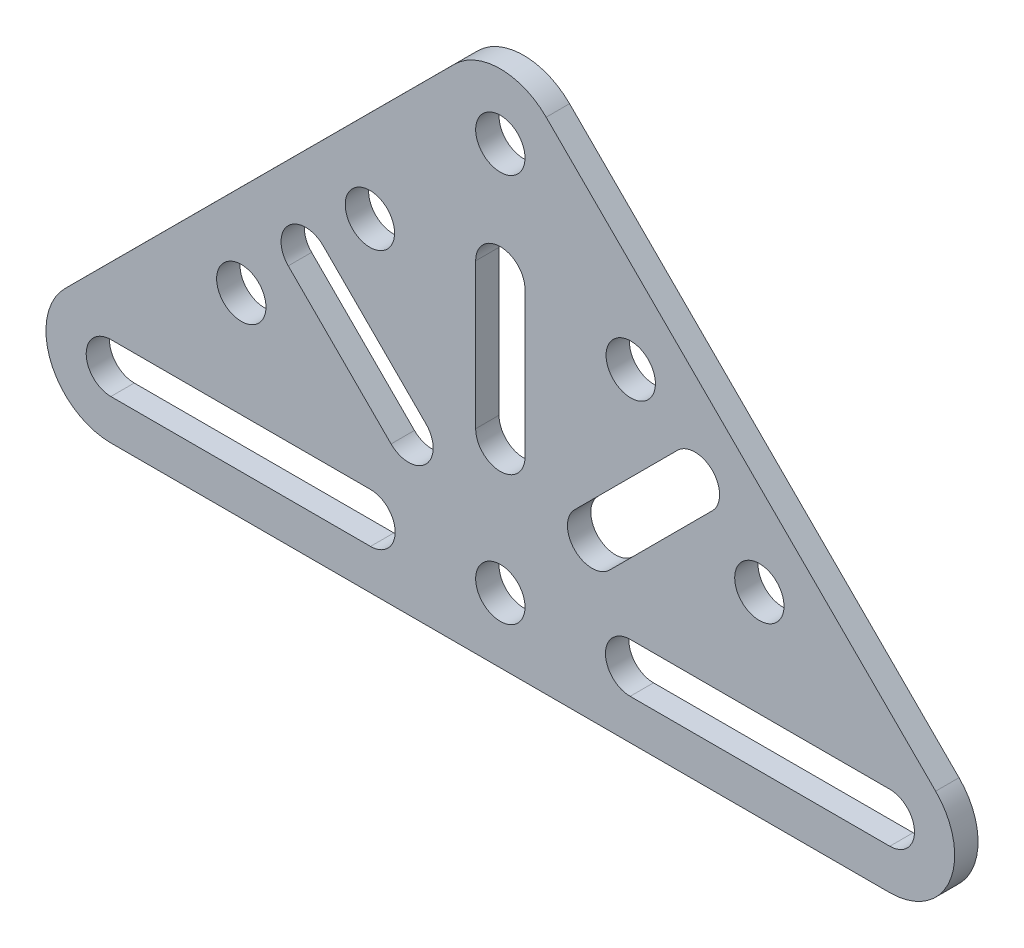
ISO-10303-21;
HEADER;
FILE_DESCRIPTION(('STEP AP214'),'2;1');
FILE_NAME('part.step','',(''),(''),'','','');
FILE_SCHEMA(('AUTOMOTIVE_DESIGN { 1 0 10303 214 1 1 1 1 }'));
ENDSEC;
DATA;
#1=APPLICATION_CONTEXT('core data for automotive mechanical design processes');
#2=APPLICATION_PROTOCOL_DEFINITION('international standard','automotive_design',2000,#1);
#3=PRODUCT_CONTEXT('',#1,'mechanical');
#4=PRODUCT('Part','Part','',(#3));
#5=PRODUCT_RELATED_PRODUCT_CATEGORY('part','',(#4));
#6=PRODUCT_DEFINITION_FORMATION('','',#4);
#7=PRODUCT_DEFINITION_CONTEXT('part definition',#1,'design');
#8=PRODUCT_DEFINITION('design','',#6,#7);
#9=PRODUCT_DEFINITION_SHAPE('','',#8);
#10=(LENGTH_UNIT() NAMED_UNIT(*) SI_UNIT(.MILLI.,.METRE.));
#11=(NAMED_UNIT(*) PLANE_ANGLE_UNIT() SI_UNIT($,.RADIAN.));
#12=(NAMED_UNIT(*) SI_UNIT($,.STERADIAN.) SOLID_ANGLE_UNIT());
#13=UNCERTAINTY_MEASURE_WITH_UNIT(LENGTH_MEASURE(1.E-05),#10,'distance_accuracy_value','');
#14=(GEOMETRIC_REPRESENTATION_CONTEXT(3) GLOBAL_UNCERTAINTY_ASSIGNED_CONTEXT((#13)) GLOBAL_UNIT_ASSIGNED_CONTEXT((#10,
#11,#12)) REPRESENTATION_CONTEXT('',''));
#15=CARTESIAN_POINT('',(0.,0.,0.));
#16=DIRECTION('',(0.,0.,1.));
#17=DIRECTION('',(1.,0.,0.));
#18=AXIS2_PLACEMENT_3D('',#15,#16,#17);
#19=CARTESIAN_POINT('',(-38.1,0.,2.286));
#20=DIRECTION('',(0.,0.,-1.));
#21=DIRECTION('',(-1.,0.,0.));
#22=AXIS2_PLACEMENT_3D('',#19,#20,#21);
#23=CYLINDRICAL_SURFACE('',#22,6.35);
#24=CARTESIAN_POINT('',(-38.1,0.,0.));
#25=DIRECTION('',(0.,0.,1.));
#26=DIRECTION('',(1.,0.,0.));
#27=AXIS2_PLACEMENT_3D('',#24,#25,#26);
#28=CIRCLE('',#27,6.35);
#29=CARTESIAN_POINT('',(-42.5873298500313,4.492924528302,0.));
#30=VERTEX_POINT('',#29);
#31=CARTESIAN_POINT('',(-38.0999999999998,-6.35,0.));
#32=VERTEX_POINT('',#31);
#33=EDGE_CURVE('E417',#30,#32,#28,.T.);
#34=ORIENTED_EDGE('',*,*,#33,.T.);
#35=DIRECTION('',(0.,0.,-1.));
#36=VECTOR('',#35,1.);
#37=CARTESIAN_POINT('',(-38.0999999999998,-6.35,2.286));
#38=LINE('',#37,#36);
#39=CARTESIAN_POINT('',(-38.0999999999998,-6.35,2.286));
#40=VERTEX_POINT('',#39);
#41=EDGE_CURVE('E13',#40,#32,#38,.T.);
#42=ORIENTED_EDGE('',*,*,#41,.F.);
#43=CARTESIAN_POINT('',(-38.1,0.,2.286));
#44=DIRECTION('',(0.,0.,1.));
#45=DIRECTION('',(1.,0.,0.));
#46=AXIS2_PLACEMENT_3D('',#43,#44,#45);
#47=CIRCLE('',#46,6.35);
#48=CARTESIAN_POINT('',(-42.5873298500313,4.492924528302,2.286));
#49=VERTEX_POINT('',#48);
#50=EDGE_CURVE('E430',#49,#40,#47,.T.);
#51=ORIENTED_EDGE('',*,*,#50,.F.);
#52=DIRECTION('',(0.,0.,-1.));
#53=VECTOR('',#52,1.);
#54=CARTESIAN_POINT('',(-42.5873298500313,4.492924528302,2.286));
#55=LINE('',#54,#53);
#56=EDGE_CURVE('E443',#49,#30,#55,.T.);
#57=ORIENTED_EDGE('',*,*,#56,.T.);
#58=EDGE_LOOP('',(#34,#42,#51,#57));
#59=FACE_BOUND('',#58,.T.);
#60=ADVANCED_FACE('F46',(#59),#23,.T.);
#61=CARTESIAN_POINT('',(-38.0999999999998,-6.35,2.286));
#62=DIRECTION('',(0.,1.,0.));
#63=DIRECTION('',(-1.,0.,0.));
#64=AXIS2_PLACEMENT_3D('',#61,#62,#63);
#65=PLANE('',#64);
#66=DIRECTION('',(1.,0.,0.));
#67=VECTOR('',#66,1.);
#68=CARTESIAN_POINT('',(-38.0999999999998,-6.35,0.));
#69=LINE('',#68,#67);
#70=CARTESIAN_POINT('',(38.0999999999998,-6.35,0.));
#71=VERTEX_POINT('',#70);
#72=EDGE_CURVE('E420',#32,#71,#69,.T.);
#73=ORIENTED_EDGE('',*,*,#72,.T.);
#74=DIRECTION('',(0.,0.,-1.));
#75=VECTOR('',#74,1.);
#76=CARTESIAN_POINT('',(38.0999999999998,-6.35,2.286));
#77=LINE('',#76,#75);
#78=CARTESIAN_POINT('',(38.0999999999998,-6.35,2.286));
#79=VERTEX_POINT('',#78);
#80=EDGE_CURVE('E53',#79,#71,#77,.T.);
#81=ORIENTED_EDGE('',*,*,#80,.F.);
#82=DIRECTION('',(1.,0.,0.));
#83=VECTOR('',#82,1.);
#84=CARTESIAN_POINT('',(-38.0999999999998,-6.35,2.286));
#85=LINE('',#84,#83);
#86=EDGE_CURVE('E433',#40,#79,#85,.T.);
#87=ORIENTED_EDGE('',*,*,#86,.F.);
#88=ORIENTED_EDGE('',*,*,#41,.T.);
#89=EDGE_LOOP('',(#73,#81,#87,#88));
#90=FACE_BOUND('',#89,.T.);
#91=ADVANCED_FACE('F481',(#90),#65,.F.);
#92=CARTESIAN_POINT('',(38.1,0.,2.286));
#93=DIRECTION('',(0.,0.,-1.));
#94=DIRECTION('',(-1.,0.,0.));
#95=AXIS2_PLACEMENT_3D('',#92,#93,#94);
#96=CYLINDRICAL_SURFACE('',#95,6.35);
#97=CARTESIAN_POINT('',(38.1,0.,0.));
#98=DIRECTION('',(0.,0.,1.));
#99=DIRECTION('',(-1.,0.,0.));
#100=AXIS2_PLACEMENT_3D('',#97,#98,#99);
#101=CIRCLE('',#100,6.35);
#102=CARTESIAN_POINT('',(42.5873298500313,4.492924528302,0.));
#103=VERTEX_POINT('',#102);
#104=EDGE_CURVE('E422',#71,#103,#101,.T.);
#105=ORIENTED_EDGE('',*,*,#104,.T.);
#106=DIRECTION('',(0.,0.,-1.));
#107=VECTOR('',#106,1.);
#108=CARTESIAN_POINT('',(42.5873298500313,4.492924528302,2.286));
#109=LINE('',#108,#107);
#110=CARTESIAN_POINT('',(42.5873298500313,4.492924528302,2.286));
#111=VERTEX_POINT('',#110);
#112=EDGE_CURVE('E452',#111,#103,#109,.T.);
#113=ORIENTED_EDGE('',*,*,#112,.F.);
#114=CARTESIAN_POINT('',(38.1,0.,2.286));
#115=DIRECTION('',(0.,0.,1.));
#116=DIRECTION('',(-1.,0.,0.));
#117=AXIS2_PLACEMENT_3D('',#114,#115,#116);
#118=CIRCLE('',#117,6.35);
#119=EDGE_CURVE('E435',#79,#111,#118,.T.);
#120=ORIENTED_EDGE('',*,*,#119,.F.);
#121=ORIENTED_EDGE('',*,*,#80,.T.);
#122=EDGE_LOOP('',(#105,#113,#120,#121));
#123=FACE_BOUND('',#122,.T.);
#124=ADVANCED_FACE('F459',(#123),#96,.T.);
#125=CARTESIAN_POINT('',(42.5873298500313,4.492924528302,2.286));
#126=DIRECTION('',(-0.706666118115189,-0.707547169811321,0.));
#127=DIRECTION('',(0.707547169811321,-0.706666118115189,0.));
#128=AXIS2_PLACEMENT_3D('',#125,#126,#127);
#129=PLANE('',#128);
#130=DIRECTION('',(-0.707547169811321,0.706666118115189,0.));
#131=VECTOR('',#130,1.);
#132=CARTESIAN_POINT('',(42.5873298500313,4.492924528302,0.));
#133=LINE('',#132,#131);
#134=CARTESIAN_POINT('',(4.48732985003149,42.5454816565685,0.));
#135=VERTEX_POINT('',#134);
#136=EDGE_CURVE('E424',#103,#135,#133,.T.);
#137=ORIENTED_EDGE('',*,*,#136,.T.);
#138=DIRECTION('',(0.,0.,-1.));
#139=VECTOR('',#138,1.);
#140=CARTESIAN_POINT('',(4.48732985003149,42.5454816565685,2.286));
#141=LINE('',#140,#139);
#142=CARTESIAN_POINT('',(4.48732985003149,42.5454816565685,2.286));
#143=VERTEX_POINT('',#142);
#144=EDGE_CURVE('E449',#143,#135,#141,.T.);
#145=ORIENTED_EDGE('',*,*,#144,.F.);
#146=DIRECTION('',(-0.707547169811321,0.706666118115189,0.));
#147=VECTOR('',#146,1.);
#148=CARTESIAN_POINT('',(42.5873298500313,4.492924528302,2.286));
#149=LINE('',#148,#147);
#150=EDGE_CURVE('E437',#111,#143,#149,.T.);
#151=ORIENTED_EDGE('',*,*,#150,.F.);
#152=ORIENTED_EDGE('',*,*,#112,.T.);
#153=EDGE_LOOP('',(#137,#145,#151,#152));
#154=FACE_BOUND('',#153,.T.);
#155=ADVANCED_FACE('F470',(#154),#129,.F.);
#156=CARTESIAN_POINT('',(0.,38.0525571282667,2.286));
#157=DIRECTION('',(0.,0.,-1.));
#158=DIRECTION('',(-1.,0.,0.));
#159=AXIS2_PLACEMENT_3D('',#156,#157,#158);
#160=CYLINDRICAL_SURFACE('',#159,6.35);
#161=CARTESIAN_POINT('',(0.,38.0525571282667,0.));
#162=DIRECTION('',(0.,0.,1.));
#163=DIRECTION('',(-1.,0.,0.));
#164=AXIS2_PLACEMENT_3D('',#161,#162,#163);
#165=CIRCLE('',#164,6.35);
#166=CARTESIAN_POINT('',(-4.48732985003147,42.5454816565685,0.));
#167=VERTEX_POINT('',#166);
#168=EDGE_CURVE('E426',#135,#167,#165,.T.);
#169=ORIENTED_EDGE('',*,*,#168,.T.);
#170=DIRECTION('',(0.,0.,-1.));
#171=VECTOR('',#170,1.);
#172=CARTESIAN_POINT('',(-4.48732985003147,42.5454816565685,2.286));
#173=LINE('',#172,#171);
#174=CARTESIAN_POINT('',(-4.48732985003147,42.5454816565685,2.286));
#175=VERTEX_POINT('',#174);
#176=EDGE_CURVE('E446',#175,#167,#173,.T.);
#177=ORIENTED_EDGE('',*,*,#176,.F.);
#178=CARTESIAN_POINT('',(0.,38.0525571282667,2.286));
#179=DIRECTION('',(0.,0.,1.));
#180=DIRECTION('',(-1.,0.,0.));
#181=AXIS2_PLACEMENT_3D('',#178,#179,#180);
#182=CIRCLE('',#181,6.35);
#183=EDGE_CURVE('E439',#143,#175,#182,.T.);
#184=ORIENTED_EDGE('',*,*,#183,.F.);
#185=ORIENTED_EDGE('',*,*,#144,.T.);
#186=EDGE_LOOP('',(#169,#177,#184,#185));
#187=FACE_BOUND('',#186,.T.);
#188=ADVANCED_FACE('F474',(#187),#160,.T.);
#189=CARTESIAN_POINT('',(-42.5873298500313,4.492924528302,2.286));
#190=DIRECTION('',(0.706666118115189,-0.707547169811321,0.));
#191=DIRECTION('',(0.707547169811321,0.706666118115189,0.));
#192=AXIS2_PLACEMENT_3D('',#189,#190,#191);
#193=PLANE('',#192);
#194=DIRECTION('',(-0.707547169811321,-0.706666118115189,0.));
#195=VECTOR('',#194,1.);
#196=CARTESIAN_POINT('',(-42.5873298500313,4.492924528302,0.));
#197=LINE('',#196,#195);
#198=EDGE_CURVE('E428',#167,#30,#197,.T.);
#199=ORIENTED_EDGE('',*,*,#198,.T.);
#200=ORIENTED_EDGE('',*,*,#56,.F.);
#201=DIRECTION('',(-0.707547169811321,-0.706666118115189,0.));
#202=VECTOR('',#201,1.);
#203=CARTESIAN_POINT('',(-42.5873298500313,4.492924528302,2.286));
#204=LINE('',#203,#202);
#205=EDGE_CURVE('E441',#175,#49,#204,.T.);
#206=ORIENTED_EDGE('',*,*,#205,.F.);
#207=ORIENTED_EDGE('',*,*,#176,.T.);
#208=EDGE_LOOP('',(#199,#200,#206,#207));
#209=FACE_BOUND('',#208,.T.);
#210=ADVANCED_FACE('F484',(#209),#193,.F.);
#211=CARTESIAN_POINT('',(-38.1,0.,2.286));
#212=DIRECTION('',(0.,0.,1.));
#213=DIRECTION('',(1.,0.,0.));
#214=AXIS2_PLACEMENT_3D('',#211,#212,#213);
#215=PLANE('',#214);
#216=CARTESIAN_POINT('',(19.0391948819438,19.0391948819437,2.286));
#217=DIRECTION('',(0.,0.,1.));
#218=DIRECTION('',(0.,-1.,0.));
#219=AXIS2_PLACEMENT_3D('',#216,#217,#218);
#220=CIRCLE('',#219,2.413);
#221=CARTESIAN_POINT('',(20.745443544947,17.3329462189405,2.286));
#222=VERTEX_POINT('',#221);
#223=CARTESIAN_POINT('',(17.3329462189407,20.7454435449468,2.286));
#224=VERTEX_POINT('',#223);
#225=EDGE_CURVE('E60',#222,#224,#220,.T.);
#226=ORIENTED_EDGE('',*,*,#225,.F.);
#227=DIRECTION('',(0.70710678118655,0.707106781186545,0.));
#228=VECTOR('',#227,1.);
#229=CARTESIAN_POINT('',(20.745443544947,17.3329462189405,2.286));
#230=LINE('',#229,#228);
#231=CARTESIAN_POINT('',(10.6875566893495,7.27505936334313,2.286));
#232=VERTEX_POINT('',#231);
#233=EDGE_CURVE('E236',#232,#222,#230,.T.);
#234=ORIENTED_EDGE('',*,*,#233,.F.);
#235=CARTESIAN_POINT('',(8.98130802634634,8.98130802634627,2.286));
#236=DIRECTION('',(0.,0.,1.));
#237=DIRECTION('',(0.,1.,0.));
#238=AXIS2_PLACEMENT_3D('',#235,#236,#237);
#239=CIRCLE('',#238,2.413);
#240=CARTESIAN_POINT('',(7.2750593633432,10.6875566893494,2.286));
#241=VERTEX_POINT('',#240);
#242=EDGE_CURVE('E230',#241,#232,#239,.T.);
#243=ORIENTED_EDGE('',*,*,#242,.F.);
#244=DIRECTION('',(-0.70710678118655,-0.707106781186545,0.));
#245=VECTOR('',#244,1.);
#246=CARTESIAN_POINT('',(17.3329462189407,20.7454435449468,2.286));
#247=LINE('',#246,#245);
#248=EDGE_CURVE('E220',#224,#241,#247,.T.);
#249=ORIENTED_EDGE('',*,*,#248,.F.);
#250=EDGE_LOOP('',(#226,#234,#243,#249));
#251=FACE_BOUND('',#250,.T.);
#252=CARTESIAN_POINT('',(0.,26.9254876187093,2.286));
#253=DIRECTION('',(0.,0.,1.));
#254=DIRECTION('',(0.707106781186546,-0.707106781186549,0.));
#255=AXIS2_PLACEMENT_3D('',#252,#253,#254);
#256=CIRCLE('',#255,2.413);
#257=CARTESIAN_POINT('',(2.41300000000005,26.9254876187093,2.286));
#258=VERTEX_POINT('',#257);
#259=CARTESIAN_POINT('',(-2.41299999999995,26.9254876187093,2.286));
#260=VERTEX_POINT('',#259);
#261=EDGE_CURVE('E280',#258,#260,#256,.T.);
#262=ORIENTED_EDGE('',*,*,#261,.F.);
#263=DIRECTION('',(0.,1.,0.));
#264=VECTOR('',#263,1.);
#265=CARTESIAN_POINT('',(2.41300000000005,26.9254876187093,2.286));
#266=LINE('',#265,#264);
#267=CARTESIAN_POINT('',(2.41300000000002,12.7014876187093,2.286));
#268=VERTEX_POINT('',#267);
#269=EDGE_CURVE('E272',#268,#258,#266,.T.);
#270=ORIENTED_EDGE('',*,*,#269,.F.);
#271=CARTESIAN_POINT('',(0.,12.7014876187093,2.286));
#272=DIRECTION('',(0.,0.,1.));
#273=DIRECTION('',(-0.707106781186546,0.707106781186549,0.));
#274=AXIS2_PLACEMENT_3D('',#271,#272,#273);
#275=CIRCLE('',#274,2.413);
#276=CARTESIAN_POINT('',(-2.41299999999998,12.7014876187093,2.286));
#277=VERTEX_POINT('',#276);
#278=EDGE_CURVE('E264',#277,#268,#275,.T.);
#279=ORIENTED_EDGE('',*,*,#278,.F.);
#280=DIRECTION('',(0.,-1.,0.));
#281=VECTOR('',#280,1.);
#282=CARTESIAN_POINT('',(-2.41299999999995,26.9254876187093,2.286));
#283=LINE('',#282,#281);
#284=EDGE_CURVE('E253',#260,#277,#283,.T.);
#285=ORIENTED_EDGE('',*,*,#284,.F.);
#286=EDGE_LOOP('',(#262,#270,#279,#285));
#287=FACE_BOUND('',#286,.T.);
#288=CARTESIAN_POINT('',(-19.0391948819438,19.0391948819438,2.286));
#289=DIRECTION('',(0.,0.,1.));
#290=DIRECTION('',(1.,0.,0.));
#291=AXIS2_PLACEMENT_3D('',#288,#289,#290);
#292=CIRCLE('',#291,2.413);
#293=CARTESIAN_POINT('',(-17.3329462189406,20.7454435449469,2.286));
#294=VERTEX_POINT('',#293);
#295=CARTESIAN_POINT('',(-20.7454435449469,17.3329462189406,2.286));
#296=VERTEX_POINT('',#295);
#297=EDGE_CURVE('E285',#294,#296,#292,.T.);
#298=ORIENTED_EDGE('',*,*,#297,.F.);
#299=DIRECTION('',(-0.707106781186547,0.707106781186548,0.));
#300=VECTOR('',#299,1.);
#301=CARTESIAN_POINT('',(-17.3329462189406,20.7454435449469,2.286));
#302=LINE('',#301,#300);
#303=CARTESIAN_POINT('',(-7.27505936334317,10.6875566893494,2.286));
#304=VERTEX_POINT('',#303);
#305=EDGE_CURVE('E293',#304,#294,#302,.T.);
#306=ORIENTED_EDGE('',*,*,#305,.F.);
#307=CARTESIAN_POINT('',(-8.9813080263463,8.9813080263463,2.286));
#308=DIRECTION('',(0.,0.,1.));
#309=DIRECTION('',(-1.,0.,0.));
#310=AXIS2_PLACEMENT_3D('',#307,#308,#309);
#311=CIRCLE('',#310,2.413);
#312=CARTESIAN_POINT('',(-10.6875566893494,7.27505936334317,2.286));
#313=VERTEX_POINT('',#312);
#314=EDGE_CURVE('E290',#313,#304,#311,.T.);
#315=ORIENTED_EDGE('',*,*,#314,.F.);
#316=DIRECTION('',(0.707106781186547,-0.707106781186547,0.));
#317=VECTOR('',#316,1.);
#318=CARTESIAN_POINT('',(-20.7454435449469,17.3329462189406,2.286));
#319=LINE('',#318,#317);
#320=EDGE_CURVE('E287',#296,#313,#319,.T.);
#321=ORIENTED_EDGE('',*,*,#320,.F.);
#322=EDGE_LOOP('',(#298,#306,#315,#321));
#323=FACE_BOUND('',#322,.T.);
#324=CARTESIAN_POINT('',(38.1,0.,2.286));
#325=DIRECTION('',(0.,0.,-1.));
#326=DIRECTION('',(-1.,0.,0.));
#327=AXIS2_PLACEMENT_3D('',#324,#325,#326);
#328=CIRCLE('',#327,2.413);
#329=CARTESIAN_POINT('',(38.1,2.413,2.286));
#330=VERTEX_POINT('',#329);
#331=CARTESIAN_POINT('',(38.1,-2.413,2.286));
#332=VERTEX_POINT('',#331);
#333=EDGE_CURVE('E344',#330,#332,#328,.T.);
#334=ORIENTED_EDGE('',*,*,#333,.T.);
#335=DIRECTION('',(-1.,0.,0.));
#336=VECTOR('',#335,1.);
#337=CARTESIAN_POINT('',(38.1,-2.413,2.286));
#338=LINE('',#337,#336);
#339=CARTESIAN_POINT('',(12.7,-2.413,2.286));
#340=VERTEX_POINT('',#339);
#341=EDGE_CURVE('E311',#332,#340,#338,.T.);
#342=ORIENTED_EDGE('',*,*,#341,.T.);
#343=CARTESIAN_POINT('',(12.7,0.,2.286));
#344=DIRECTION('',(0.,0.,-1.));
#345=DIRECTION('',(1.,0.,0.));
#346=AXIS2_PLACEMENT_3D('',#343,#344,#345);
#347=CIRCLE('',#346,2.413);
#348=CARTESIAN_POINT('',(12.7,2.413,2.286));
#349=VERTEX_POINT('',#348);
#350=EDGE_CURVE('E328',#340,#349,#347,.T.);
#351=ORIENTED_EDGE('',*,*,#350,.T.);
#352=DIRECTION('',(1.,0.,0.));
#353=VECTOR('',#352,1.);
#354=CARTESIAN_POINT('',(38.1,2.413,2.286));
#355=LINE('',#354,#353);
#356=EDGE_CURVE('E336',#349,#330,#355,.T.);
#357=ORIENTED_EDGE('',*,*,#356,.T.);
#358=EDGE_LOOP('',(#334,#342,#351,#357));
#359=FACE_BOUND('',#358,.T.);
#360=CARTESIAN_POINT('',(-38.1,0.,2.286));
#361=DIRECTION('',(0.,0.,1.));
#362=DIRECTION('',(1.,0.,0.));
#363=AXIS2_PLACEMENT_3D('',#360,#361,#362);
#364=CIRCLE('',#363,2.413);
#365=CARTESIAN_POINT('',(-38.1,2.413,2.286));
#366=VERTEX_POINT('',#365);
#367=CARTESIAN_POINT('',(-38.1,-2.413,2.286));
#368=VERTEX_POINT('',#367);
#369=EDGE_CURVE('E349',#366,#368,#364,.T.);
#370=ORIENTED_EDGE('',*,*,#369,.F.);
#371=DIRECTION('',(-1.,0.,0.));
#372=VECTOR('',#371,1.);
#373=CARTESIAN_POINT('',(-38.1,2.413,2.286));
#374=LINE('',#373,#372);
#375=CARTESIAN_POINT('',(-12.7,2.413,2.286));
#376=VERTEX_POINT('',#375);
#377=EDGE_CURVE('E357',#376,#366,#374,.T.);
#378=ORIENTED_EDGE('',*,*,#377,.F.);
#379=CARTESIAN_POINT('',(-12.7,0.,2.286));
#380=DIRECTION('',(0.,0.,1.));
#381=DIRECTION('',(-1.,0.,0.));
#382=AXIS2_PLACEMENT_3D('',#379,#380,#381);
#383=CIRCLE('',#382,2.413);
#384=CARTESIAN_POINT('',(-12.7,-2.413,2.286));
#385=VERTEX_POINT('',#384);
#386=EDGE_CURVE('E354',#385,#376,#383,.T.);
#387=ORIENTED_EDGE('',*,*,#386,.F.);
#388=DIRECTION('',(1.,0.,0.));
#389=VECTOR('',#388,1.);
#390=CARTESIAN_POINT('',(-38.1,-2.413,2.286));
#391=LINE('',#390,#389);
#392=EDGE_CURVE('E351',#368,#385,#391,.T.);
#393=ORIENTED_EDGE('',*,*,#392,.F.);
#394=EDGE_LOOP('',(#370,#378,#387,#393));
#395=FACE_BOUND('',#394,.T.);
#396=CARTESIAN_POINT('',(12.7599056603774,25.3085403541774,2.286));
#397=DIRECTION('',(0.,0.,1.));
#398=DIRECTION('',(-1.,0.,0.));
#399=AXIS2_PLACEMENT_3D('',#396,#397,#398);
#400=CIRCLE('',#399,2.413);
#401=CARTESIAN_POINT('',(10.3469056603774,25.3085403541774,2.286));
#402=VERTEX_POINT('',#401);
#403=EDGE_CURVE('E375',#402,#402,#400,.T.);
#404=ORIENTED_EDGE('',*,*,#403,.F.);
#405=EDGE_LOOP('',(#404));
#406=FACE_BOUND('',#405,.T.);
#407=CARTESIAN_POINT('',(-12.7599056603774,25.3085403541774,2.286));
#408=DIRECTION('',(0.,0.,1.));
#409=DIRECTION('',(1.,0.,0.));
#410=AXIS2_PLACEMENT_3D('',#407,#408,#409);
#411=CIRCLE('',#410,2.413);
#412=CARTESIAN_POINT('',(-10.3469056603774,25.3085403541774,2.286));
#413=VERTEX_POINT('',#412);
#414=EDGE_CURVE('E387',#413,#413,#411,.T.);
#415=ORIENTED_EDGE('',*,*,#414,.F.);
#416=EDGE_LOOP('',(#415));
#417=FACE_BOUND('',#416,.T.);
#418=CARTESIAN_POINT('',(25.3400943396226,12.7440167740893,2.286));
#419=DIRECTION('',(0.,0.,1.));
#420=DIRECTION('',(-1.,0.,0.));
#421=AXIS2_PLACEMENT_3D('',#418,#419,#420);
#422=CIRCLE('',#421,2.41299999999999);
#423=CARTESIAN_POINT('',(22.9270943396226,12.7440167740893,2.286));
#424=VERTEX_POINT('',#423);
#425=EDGE_CURVE('E393',#424,#424,#422,.T.);
#426=ORIENTED_EDGE('',*,*,#425,.F.);
#427=EDGE_LOOP('',(#426));
#428=FACE_BOUND('',#427,.T.);
#429=CARTESIAN_POINT('',(-25.3400943396226,12.7440167740893,2.286));
#430=DIRECTION('',(0.,0.,1.));
#431=DIRECTION('',(1.,0.,0.));
#432=AXIS2_PLACEMENT_3D('',#429,#430,#431);
#433=CIRCLE('',#432,2.413);
#434=CARTESIAN_POINT('',(-22.9270943396226,12.7440167740893,2.286));
#435=VERTEX_POINT('',#434);
#436=EDGE_CURVE('E399',#435,#435,#433,.T.);
#437=ORIENTED_EDGE('',*,*,#436,.F.);
#438=EDGE_LOOP('',(#437));
#439=FACE_BOUND('',#438,.T.);
#440=CARTESIAN_POINT('',(0.,38.0525571282667,2.286));
#441=DIRECTION('',(0.,0.,1.));
#442=DIRECTION('',(1.,0.,0.));
#443=AXIS2_PLACEMENT_3D('',#440,#441,#442);
#444=CIRCLE('',#443,2.413);
#445=CARTESIAN_POINT('',(2.413,38.0525571282667,2.286));
#446=VERTEX_POINT('',#445);
#447=EDGE_CURVE('E405',#446,#446,#444,.T.);
#448=ORIENTED_EDGE('',*,*,#447,.F.);
#449=EDGE_LOOP('',(#448));
#450=FACE_BOUND('',#449,.T.);
#451=CARTESIAN_POINT('',(0.,0.,2.286));
#452=DIRECTION('',(0.,0.,1.));
#453=DIRECTION('',(1.,0.,0.));
#454=AXIS2_PLACEMENT_3D('',#451,#452,#453);
#455=CIRCLE('',#454,2.413);
#456=CARTESIAN_POINT('',(2.413,0.,2.286));
#457=VERTEX_POINT('',#456);
#458=EDGE_CURVE('E411',#457,#457,#455,.T.);
#459=ORIENTED_EDGE('',*,*,#458,.F.);
#460=EDGE_LOOP('',(#459));
#461=FACE_BOUND('',#460,.T.);
#462=ORIENTED_EDGE('',*,*,#50,.T.);
#463=ORIENTED_EDGE('',*,*,#86,.T.);
#464=ORIENTED_EDGE('',*,*,#119,.T.);
#465=ORIENTED_EDGE('',*,*,#150,.T.);
#466=ORIENTED_EDGE('',*,*,#183,.T.);
#467=ORIENTED_EDGE('',*,*,#205,.T.);
#468=EDGE_LOOP('',(#462,#463,#464,#465,#466,#467));
#469=FACE_BOUND('',#468,.T.);
#470=ADVANCED_FACE('F234',(#251,#287,#323,#359,#395,#406,#417,#428,#439,#450,#461,#469),#215,.T.);
#471=CARTESIAN_POINT('',(-38.1,0.,0.));
#472=DIRECTION('',(0.,0.,1.));
#473=DIRECTION('',(1.,0.,0.));
#474=AXIS2_PLACEMENT_3D('',#471,#472,#473);
#475=PLANE('',#474);
#476=DIRECTION('',(0.70710678118655,0.707106781186545,0.));
#477=VECTOR('',#476,1.);
#478=CARTESIAN_POINT('',(20.745443544947,17.3329462189405,0.));
#479=LINE('',#478,#477);
#480=CARTESIAN_POINT('',(10.6875566893495,7.27505936334313,0.));
#481=VERTEX_POINT('',#480);
#482=CARTESIAN_POINT('',(20.745443544947,17.3329462189405,0.));
#483=VERTEX_POINT('',#482);
#484=EDGE_CURVE('E246',#481,#483,#479,.T.);
#485=ORIENTED_EDGE('',*,*,#484,.T.);
#486=CARTESIAN_POINT('',(19.0391948819438,19.0391948819437,0.));
#487=DIRECTION('',(0.,0.,1.));
#488=DIRECTION('',(0.,-1.,0.));
#489=AXIS2_PLACEMENT_3D('',#486,#487,#488);
#490=CIRCLE('',#489,2.413);
#491=CARTESIAN_POINT('',(17.3329462189407,20.7454435449468,0.));
#492=VERTEX_POINT('',#491);
#493=EDGE_CURVE('E250',#483,#492,#490,.T.);
#494=ORIENTED_EDGE('',*,*,#493,.T.);
#495=DIRECTION('',(-0.70710678118655,-0.707106781186545,0.));
#496=VECTOR('',#495,1.);
#497=CARTESIAN_POINT('',(17.3329462189407,20.7454435449468,0.));
#498=LINE('',#497,#496);
#499=CARTESIAN_POINT('',(7.2750593633432,10.6875566893494,0.));
#500=VERTEX_POINT('',#499);
#501=EDGE_CURVE('E227',#492,#500,#498,.T.);
#502=ORIENTED_EDGE('',*,*,#501,.T.);
#503=CARTESIAN_POINT('',(8.98130802634634,8.98130802634627,0.));
#504=DIRECTION('',(0.,0.,1.));
#505=DIRECTION('',(0.,1.,0.));
#506=AXIS2_PLACEMENT_3D('',#503,#504,#505);
#507=CIRCLE('',#506,2.413);
#508=EDGE_CURVE('E68',#500,#481,#507,.T.);
#509=ORIENTED_EDGE('',*,*,#508,.T.);
#510=EDGE_LOOP('',(#485,#494,#502,#509));
#511=FACE_BOUND('',#510,.T.);
#512=DIRECTION('',(0.,1.,0.));
#513=VECTOR('',#512,1.);
#514=CARTESIAN_POINT('',(2.41300000000005,26.9254876187093,0.));
#515=LINE('',#514,#513);
#516=CARTESIAN_POINT('',(2.41300000000002,12.7014876187093,0.));
#517=VERTEX_POINT('',#516);
#518=CARTESIAN_POINT('',(2.41300000000005,26.9254876187093,0.));
#519=VERTEX_POINT('',#518);
#520=EDGE_CURVE('E277',#517,#519,#515,.T.);
#521=ORIENTED_EDGE('',*,*,#520,.T.);
#522=CARTESIAN_POINT('',(0.,26.9254876187093,0.));
#523=DIRECTION('',(0.,0.,1.));
#524=DIRECTION('',(0.707106781186546,-0.707106781186549,0.));
#525=AXIS2_PLACEMENT_3D('',#522,#523,#524);
#526=CIRCLE('',#525,2.413);
#527=CARTESIAN_POINT('',(-2.41299999999995,26.9254876187093,0.));
#528=VERTEX_POINT('',#527);
#529=EDGE_CURVE('E282',#519,#528,#526,.T.);
#530=ORIENTED_EDGE('',*,*,#529,.T.);
#531=DIRECTION('',(0.,-1.,0.));
#532=VECTOR('',#531,1.);
#533=CARTESIAN_POINT('',(-2.41299999999995,26.9254876187093,0.));
#534=LINE('',#533,#532);
#535=CARTESIAN_POINT('',(-2.41299999999998,12.7014876187093,0.));
#536=VERTEX_POINT('',#535);
#537=EDGE_CURVE('E255',#528,#536,#534,.T.);
#538=ORIENTED_EDGE('',*,*,#537,.T.);
#539=CARTESIAN_POINT('',(0.,12.7014876187093,0.));
#540=DIRECTION('',(0.,0.,1.));
#541=DIRECTION('',(-0.707106781186546,0.707106781186549,0.));
#542=AXIS2_PLACEMENT_3D('',#539,#540,#541);
#543=CIRCLE('',#542,2.413);
#544=EDGE_CURVE('E269',#536,#517,#543,.T.);
#545=ORIENTED_EDGE('',*,*,#544,.T.);
#546=EDGE_LOOP('',(#521,#530,#538,#545));
#547=FACE_BOUND('',#546,.T.);
#548=DIRECTION('',(-0.707106781186547,0.707106781186548,0.));
#549=VECTOR('',#548,1.);
#550=CARTESIAN_POINT('',(-17.3329462189406,20.7454435449469,0.));
#551=LINE('',#550,#549);
#552=CARTESIAN_POINT('',(-7.27505936334317,10.6875566893494,0.));
#553=VERTEX_POINT('',#552);
#554=CARTESIAN_POINT('',(-17.3329462189406,20.7454435449469,0.));
#555=VERTEX_POINT('',#554);
#556=EDGE_CURVE('E305',#553,#555,#551,.T.);
#557=ORIENTED_EDGE('',*,*,#556,.T.);
#558=CARTESIAN_POINT('',(-19.0391948819438,19.0391948819438,0.));
#559=DIRECTION('',(0.,0.,1.));
#560=DIRECTION('',(1.,0.,0.));
#561=AXIS2_PLACEMENT_3D('',#558,#559,#560);
#562=CIRCLE('',#561,2.413);
#563=CARTESIAN_POINT('',(-20.7454435449469,17.3329462189406,0.));
#564=VERTEX_POINT('',#563);
#565=EDGE_CURVE('E296',#555,#564,#562,.T.);
#566=ORIENTED_EDGE('',*,*,#565,.T.);
#567=DIRECTION('',(0.707106781186547,-0.707106781186547,0.));
#568=VECTOR('',#567,1.);
#569=CARTESIAN_POINT('',(-20.7454435449469,17.3329462189406,0.));
#570=LINE('',#569,#568);
#571=CARTESIAN_POINT('',(-10.6875566893494,7.27505936334317,0.));
#572=VERTEX_POINT('',#571);
#573=EDGE_CURVE('E299',#564,#572,#570,.T.);
#574=ORIENTED_EDGE('',*,*,#573,.T.);
#575=CARTESIAN_POINT('',(-8.9813080263463,8.9813080263463,0.));
#576=DIRECTION('',(0.,0.,1.));
#577=DIRECTION('',(-1.,0.,0.));
#578=AXIS2_PLACEMENT_3D('',#575,#576,#577);
#579=CIRCLE('',#578,2.413);
#580=EDGE_CURVE('E302',#572,#553,#579,.T.);
#581=ORIENTED_EDGE('',*,*,#580,.T.);
#582=EDGE_LOOP('',(#557,#566,#574,#581));
#583=FACE_BOUND('',#582,.T.);
#584=DIRECTION('',(-1.,0.,0.));
#585=VECTOR('',#584,1.);
#586=CARTESIAN_POINT('',(38.1,-2.413,0.));
#587=LINE('',#586,#585);
#588=CARTESIAN_POINT('',(38.1,-2.413,0.));
#589=VERTEX_POINT('',#588);
#590=CARTESIAN_POINT('',(12.7,-2.413,0.));
#591=VERTEX_POINT('',#590);
#592=EDGE_CURVE('E320',#589,#591,#587,.T.);
#593=ORIENTED_EDGE('',*,*,#592,.F.);
#594=CARTESIAN_POINT('',(38.1,0.,0.));
#595=DIRECTION('',(0.,0.,-1.));
#596=DIRECTION('',(-1.,0.,0.));
#597=AXIS2_PLACEMENT_3D('',#594,#595,#596);
#598=CIRCLE('',#597,2.413);
#599=CARTESIAN_POINT('',(38.1,2.413,0.));
#600=VERTEX_POINT('',#599);
#601=EDGE_CURVE('E347',#600,#589,#598,.T.);
#602=ORIENTED_EDGE('',*,*,#601,.F.);
#603=DIRECTION('',(1.,0.,0.));
#604=VECTOR('',#603,1.);
#605=CARTESIAN_POINT('',(38.1,2.413,0.));
#606=LINE('',#605,#604);
#607=CARTESIAN_POINT('',(12.7,2.413,0.));
#608=VERTEX_POINT('',#607);
#609=EDGE_CURVE('E341',#608,#600,#606,.T.);
#610=ORIENTED_EDGE('',*,*,#609,.F.);
#611=CARTESIAN_POINT('',(12.7,0.,0.));
#612=DIRECTION('',(0.,0.,-1.));
#613=DIRECTION('',(1.,0.,0.));
#614=AXIS2_PLACEMENT_3D('',#611,#612,#613);
#615=CIRCLE('',#614,2.413);
#616=EDGE_CURVE('E333',#591,#608,#615,.T.);
#617=ORIENTED_EDGE('',*,*,#616,.F.);
#618=EDGE_LOOP('',(#593,#602,#610,#617));
#619=FACE_BOUND('',#618,.T.);
#620=DIRECTION('',(-1.,0.,0.));
#621=VECTOR('',#620,1.);
#622=CARTESIAN_POINT('',(-38.1,2.413,0.));
#623=LINE('',#622,#621);
#624=CARTESIAN_POINT('',(-12.7,2.413,0.));
#625=VERTEX_POINT('',#624);
#626=CARTESIAN_POINT('',(-38.1,2.413,0.));
#627=VERTEX_POINT('',#626);
#628=EDGE_CURVE('E369',#625,#627,#623,.T.);
#629=ORIENTED_EDGE('',*,*,#628,.T.);
#630=CARTESIAN_POINT('',(-38.1,0.,0.));
#631=DIRECTION('',(0.,0.,1.));
#632=DIRECTION('',(1.,0.,0.));
#633=AXIS2_PLACEMENT_3D('',#630,#631,#632);
#634=CIRCLE('',#633,2.413);
#635=CARTESIAN_POINT('',(-38.1,-2.413,0.));
#636=VERTEX_POINT('',#635);
#637=EDGE_CURVE('E360',#627,#636,#634,.T.);
#638=ORIENTED_EDGE('',*,*,#637,.T.);
#639=DIRECTION('',(1.,0.,0.));
#640=VECTOR('',#639,1.);
#641=CARTESIAN_POINT('',(-38.1,-2.413,0.));
#642=LINE('',#641,#640);
#643=CARTESIAN_POINT('',(-12.7,-2.413,0.));
#644=VERTEX_POINT('',#643);
#645=EDGE_CURVE('E363',#636,#644,#642,.T.);
#646=ORIENTED_EDGE('',*,*,#645,.T.);
#647=CARTESIAN_POINT('',(-12.7,0.,0.));
#648=DIRECTION('',(0.,0.,1.));
#649=DIRECTION('',(-1.,0.,0.));
#650=AXIS2_PLACEMENT_3D('',#647,#648,#649);
#651=CIRCLE('',#650,2.413);
#652=EDGE_CURVE('E366',#644,#625,#651,.T.);
#653=ORIENTED_EDGE('',*,*,#652,.T.);
#654=EDGE_LOOP('',(#629,#638,#646,#653));
#655=FACE_BOUND('',#654,.T.);
#656=CARTESIAN_POINT('',(12.7599056603774,25.3085403541774,0.));
#657=DIRECTION('',(0.,0.,1.));
#658=DIRECTION('',(-1.,0.,0.));
#659=AXIS2_PLACEMENT_3D('',#656,#657,#658);
#660=CIRCLE('',#659,2.413);
#661=CARTESIAN_POINT('',(10.3469056603774,25.3085403541774,0.));
#662=VERTEX_POINT('',#661);
#663=EDGE_CURVE('E384',#662,#662,#660,.T.);
#664=ORIENTED_EDGE('',*,*,#663,.T.);
#665=EDGE_LOOP('',(#664));
#666=FACE_BOUND('',#665,.T.);
#667=CARTESIAN_POINT('',(-12.7599056603774,25.3085403541774,0.));
#668=DIRECTION('',(0.,0.,1.));
#669=DIRECTION('',(1.,0.,0.));
#670=AXIS2_PLACEMENT_3D('',#667,#668,#669);
#671=CIRCLE('',#670,2.413);
#672=CARTESIAN_POINT('',(-10.3469056603774,25.3085403541774,0.));
#673=VERTEX_POINT('',#672);
#674=EDGE_CURVE('E390',#673,#673,#671,.T.);
#675=ORIENTED_EDGE('',*,*,#674,.T.);
#676=EDGE_LOOP('',(#675));
#677=FACE_BOUND('',#676,.T.);
#678=CARTESIAN_POINT('',(25.3400943396226,12.7440167740893,0.));
#679=DIRECTION('',(0.,0.,1.));
#680=DIRECTION('',(-1.,0.,0.));
#681=AXIS2_PLACEMENT_3D('',#678,#679,#680);
#682=CIRCLE('',#681,2.41299999999999);
#683=CARTESIAN_POINT('',(22.9270943396226,12.7440167740893,0.));
#684=VERTEX_POINT('',#683);
#685=EDGE_CURVE('E396',#684,#684,#682,.T.);
#686=ORIENTED_EDGE('',*,*,#685,.T.);
#687=EDGE_LOOP('',(#686));
#688=FACE_BOUND('',#687,.T.);
#689=CARTESIAN_POINT('',(-25.3400943396226,12.7440167740893,0.));
#690=DIRECTION('',(0.,0.,1.));
#691=DIRECTION('',(1.,0.,0.));
#692=AXIS2_PLACEMENT_3D('',#689,#690,#691);
#693=CIRCLE('',#692,2.413);
#694=CARTESIAN_POINT('',(-22.9270943396226,12.7440167740893,0.));
#695=VERTEX_POINT('',#694);
#696=EDGE_CURVE('E402',#695,#695,#693,.T.);
#697=ORIENTED_EDGE('',*,*,#696,.T.);
#698=EDGE_LOOP('',(#697));
#699=FACE_BOUND('',#698,.T.);
#700=CARTESIAN_POINT('',(0.,38.0525571282667,0.));
#701=DIRECTION('',(0.,0.,1.));
#702=DIRECTION('',(1.,0.,0.));
#703=AXIS2_PLACEMENT_3D('',#700,#701,#702);
#704=CIRCLE('',#703,2.413);
#705=CARTESIAN_POINT('',(2.413,38.0525571282667,0.));
#706=VERTEX_POINT('',#705);
#707=EDGE_CURVE('E408',#706,#706,#704,.T.);
#708=ORIENTED_EDGE('',*,*,#707,.T.);
#709=EDGE_LOOP('',(#708));
#710=FACE_BOUND('',#709,.T.);
#711=CARTESIAN_POINT('',(0.,0.,0.));
#712=DIRECTION('',(0.,0.,1.));
#713=DIRECTION('',(1.,0.,0.));
#714=AXIS2_PLACEMENT_3D('',#711,#712,#713);
#715=CIRCLE('',#714,2.413);
#716=CARTESIAN_POINT('',(2.413,0.,0.));
#717=VERTEX_POINT('',#716);
#718=EDGE_CURVE('E414',#717,#717,#715,.T.);
#719=ORIENTED_EDGE('',*,*,#718,.T.);
#720=EDGE_LOOP('',(#719));
#721=FACE_BOUND('',#720,.T.);
#722=ORIENTED_EDGE('',*,*,#33,.F.);
#723=ORIENTED_EDGE('',*,*,#198,.F.);
#724=ORIENTED_EDGE('',*,*,#168,.F.);
#725=ORIENTED_EDGE('',*,*,#136,.F.);
#726=ORIENTED_EDGE('',*,*,#104,.F.);
#727=ORIENTED_EDGE('',*,*,#72,.F.);
#728=EDGE_LOOP('',(#722,#723,#724,#725,#726,#727));
#729=FACE_BOUND('',#728,.T.);
#730=ADVANCED_FACE('F465',(#511,#547,#583,#619,#655,#666,#677,#688,#699,#710,#721,#729),#475,.F.);
#731=CARTESIAN_POINT('',(0.,0.,0.));
#732=DIRECTION('',(0.,0.,1.));
#733=DIRECTION('',(1.,0.,0.));
#734=AXIS2_PLACEMENT_3D('',#731,#732,#733);
#735=CYLINDRICAL_SURFACE('',#734,2.413);
#736=ORIENTED_EDGE('',*,*,#718,.F.);
#737=EDGE_LOOP('',(#736));
#738=FACE_BOUND('',#737,.T.);
#739=ORIENTED_EDGE('',*,*,#458,.T.);
#740=EDGE_LOOP('',(#739));
#741=FACE_BOUND('',#740,.T.);
#742=ADVANCED_FACE('F521',(#738,#741),#735,.F.);
#743=CARTESIAN_POINT('',(0.,38.0525571282667,0.));
#744=DIRECTION('',(0.,0.,1.));
#745=DIRECTION('',(1.,0.,0.));
#746=AXIS2_PLACEMENT_3D('',#743,#744,#745);
#747=CYLINDRICAL_SURFACE('',#746,2.413);
#748=ORIENTED_EDGE('',*,*,#707,.F.);
#749=EDGE_LOOP('',(#748));
#750=FACE_BOUND('',#749,.T.);
#751=ORIENTED_EDGE('',*,*,#447,.T.);
#752=EDGE_LOOP('',(#751));
#753=FACE_BOUND('',#752,.T.);
#754=ADVANCED_FACE('F526',(#750,#753),#747,.F.);
#755=CARTESIAN_POINT('',(-25.3400943396226,12.7440167740893,0.));
#756=DIRECTION('',(0.,0.,1.));
#757=DIRECTION('',(1.,0.,0.));
#758=AXIS2_PLACEMENT_3D('',#755,#756,#757);
#759=CYLINDRICAL_SURFACE('',#758,2.413);
#760=ORIENTED_EDGE('',*,*,#696,.F.);
#761=EDGE_LOOP('',(#760));
#762=FACE_BOUND('',#761,.T.);
#763=ORIENTED_EDGE('',*,*,#436,.T.);
#764=EDGE_LOOP('',(#763));
#765=FACE_BOUND('',#764,.T.);
#766=ADVANCED_FACE('F538',(#762,#765),#759,.F.);
#767=CARTESIAN_POINT('',(25.3400943396226,12.7440167740893,0.));
#768=DIRECTION('',(0.,0.,1.));
#769=DIRECTION('',(1.,0.,0.));
#770=AXIS2_PLACEMENT_3D('',#767,#768,#769);
#771=CYLINDRICAL_SURFACE('',#770,2.41299999999999);
#772=ORIENTED_EDGE('',*,*,#685,.F.);
#773=EDGE_LOOP('',(#772));
#774=FACE_BOUND('',#773,.T.);
#775=ORIENTED_EDGE('',*,*,#425,.T.);
#776=EDGE_LOOP('',(#775));
#777=FACE_BOUND('',#776,.T.);
#778=ADVANCED_FACE('F548',(#774,#777),#771,.F.);
#779=CARTESIAN_POINT('',(-12.7599056603774,25.3085403541774,0.));
#780=DIRECTION('',(0.,0.,1.));
#781=DIRECTION('',(1.,0.,0.));
#782=AXIS2_PLACEMENT_3D('',#779,#780,#781);
#783=CYLINDRICAL_SURFACE('',#782,2.413);
#784=ORIENTED_EDGE('',*,*,#674,.F.);
#785=EDGE_LOOP('',(#784));
#786=FACE_BOUND('',#785,.T.);
#787=ORIENTED_EDGE('',*,*,#414,.T.);
#788=EDGE_LOOP('',(#787));
#789=FACE_BOUND('',#788,.T.);
#790=ADVANCED_FACE('F558',(#786,#789),#783,.F.);
#791=CARTESIAN_POINT('',(12.7599056603774,25.3085403541774,0.));
#792=DIRECTION('',(0.,0.,1.));
#793=DIRECTION('',(1.,0.,0.));
#794=AXIS2_PLACEMENT_3D('',#791,#792,#793);
#795=CYLINDRICAL_SURFACE('',#794,2.413);
#796=ORIENTED_EDGE('',*,*,#663,.F.);
#797=EDGE_LOOP('',(#796));
#798=FACE_BOUND('',#797,.T.);
#799=ORIENTED_EDGE('',*,*,#403,.T.);
#800=EDGE_LOOP('',(#799));
#801=FACE_BOUND('',#800,.T.);
#802=ADVANCED_FACE('F568',(#798,#801),#795,.F.);
#803=CARTESIAN_POINT('',(-38.1,0.,0.));
#804=DIRECTION('',(0.,0.,1.));
#805=DIRECTION('',(1.,0.,0.));
#806=AXIS2_PLACEMENT_3D('',#803,#804,#805);
#807=CYLINDRICAL_SURFACE('',#806,2.413);
#808=ORIENTED_EDGE('',*,*,#369,.T.);
#809=DIRECTION('',(0.,0.,1.));
#810=VECTOR('',#809,1.);
#811=CARTESIAN_POINT('',(-38.1,-2.413,0.));
#812=LINE('',#811,#810);
#813=EDGE_CURVE('E372',#636,#368,#812,.T.);
#814=ORIENTED_EDGE('',*,*,#813,.F.);
#815=ORIENTED_EDGE('',*,*,#637,.F.);
#816=DIRECTION('',(0.,0.,1.));
#817=VECTOR('',#816,1.);
#818=CARTESIAN_POINT('',(-38.1,2.413,0.));
#819=LINE('',#818,#817);
#820=EDGE_CURVE('E373',#627,#366,#819,.T.);
#821=ORIENTED_EDGE('',*,*,#820,.T.);
#822=EDGE_LOOP('',(#808,#814,#815,#821));
#823=FACE_BOUND('',#822,.T.);
#824=ADVANCED_FACE('F578',(#823),#807,.F.);
#825=CARTESIAN_POINT('',(-38.1,2.413,0.));
#826=DIRECTION('',(0.,1.,0.));
#827=DIRECTION('',(0.,0.,1.));
#828=AXIS2_PLACEMENT_3D('',#825,#826,#827);
#829=PLANE('',#828);
#830=ORIENTED_EDGE('',*,*,#377,.T.);
#831=ORIENTED_EDGE('',*,*,#820,.F.);
#832=ORIENTED_EDGE('',*,*,#628,.F.);
#833=DIRECTION('',(0.,0.,1.));
#834=VECTOR('',#833,1.);
#835=CARTESIAN_POINT('',(-12.7,2.413,0.));
#836=LINE('',#835,#834);
#837=EDGE_CURVE('E376',#625,#376,#836,.T.);
#838=ORIENTED_EDGE('',*,*,#837,.T.);
#839=EDGE_LOOP('',(#830,#831,#832,#838));
#840=FACE_BOUND('',#839,.T.);
#841=ADVANCED_FACE('F588',(#840),#829,.F.);
#842=CARTESIAN_POINT('',(-12.7,0.,0.));
#843=DIRECTION('',(0.,0.,1.));
#844=DIRECTION('',(1.,0.,0.));
#845=AXIS2_PLACEMENT_3D('',#842,#843,#844);
#846=CYLINDRICAL_SURFACE('',#845,2.413);
#847=ORIENTED_EDGE('',*,*,#386,.T.);
#848=ORIENTED_EDGE('',*,*,#837,.F.);
#849=ORIENTED_EDGE('',*,*,#652,.F.);
#850=DIRECTION('',(0.,0.,1.));
#851=VECTOR('',#850,1.);
#852=CARTESIAN_POINT('',(-12.7,-2.413,0.));
#853=LINE('',#852,#851);
#854=EDGE_CURVE('E378',#644,#385,#853,.T.);
#855=ORIENTED_EDGE('',*,*,#854,.T.);
#856=EDGE_LOOP('',(#847,#848,#849,#855));
#857=FACE_BOUND('',#856,.T.);
#858=ADVANCED_FACE('F598',(#857),#846,.F.);
#859=CARTESIAN_POINT('',(-38.1,-2.413,0.));
#860=DIRECTION('',(0.,-1.,0.));
#861=DIRECTION('',(0.,0.,-1.));
#862=AXIS2_PLACEMENT_3D('',#859,#860,#861);
#863=PLANE('',#862);
#864=ORIENTED_EDGE('',*,*,#392,.T.);
#865=ORIENTED_EDGE('',*,*,#854,.F.);
#866=ORIENTED_EDGE('',*,*,#645,.F.);
#867=ORIENTED_EDGE('',*,*,#813,.T.);
#868=EDGE_LOOP('',(#864,#865,#866,#867));
#869=FACE_BOUND('',#868,.T.);
#870=ADVANCED_FACE('F608',(#869),#863,.F.);
#871=CARTESIAN_POINT('',(38.1,0.,0.));
#872=DIRECTION('',(0.,0.,1.));
#873=DIRECTION('',(-1.,0.,0.));
#874=AXIS2_PLACEMENT_3D('',#871,#872,#873);
#875=CYLINDRICAL_SURFACE('',#874,2.413);
#876=ORIENTED_EDGE('',*,*,#333,.F.);
#877=DIRECTION('',(0.,0.,1.));
#878=VECTOR('',#877,1.);
#879=CARTESIAN_POINT('',(38.1,2.413,0.));
#880=LINE('',#879,#878);
#881=EDGE_CURVE('E339',#600,#330,#880,.T.);
#882=ORIENTED_EDGE('',*,*,#881,.F.);
#883=ORIENTED_EDGE('',*,*,#601,.T.);
#884=DIRECTION('',(0.,0.,1.));
#885=VECTOR('',#884,1.);
#886=CARTESIAN_POINT('',(38.1,-2.413,0.));
#887=LINE('',#886,#885);
#888=EDGE_CURVE('E326',#589,#332,#887,.T.);
#889=ORIENTED_EDGE('',*,*,#888,.T.);
#890=EDGE_LOOP('',(#876,#882,#883,#889));
#891=FACE_BOUND('',#890,.T.);
#892=ADVANCED_FACE('F618',(#891),#875,.F.);
#893=CARTESIAN_POINT('',(38.1,2.413,0.));
#894=DIRECTION('',(0.,1.,0.));
#895=DIRECTION('',(0.,0.,1.));
#896=AXIS2_PLACEMENT_3D('',#893,#894,#895);
#897=PLANE('',#896);
#898=ORIENTED_EDGE('',*,*,#356,.F.);
#899=DIRECTION('',(0.,0.,1.));
#900=VECTOR('',#899,1.);
#901=CARTESIAN_POINT('',(12.7,2.413,0.));
#902=LINE('',#901,#900);
#903=EDGE_CURVE('E331',#608,#349,#902,.T.);
#904=ORIENTED_EDGE('',*,*,#903,.F.);
#905=ORIENTED_EDGE('',*,*,#609,.T.);
#906=ORIENTED_EDGE('',*,*,#881,.T.);
#907=EDGE_LOOP('',(#898,#904,#905,#906));
#908=FACE_BOUND('',#907,.T.);
#909=ADVANCED_FACE('F628',(#908),#897,.F.);
#910=CARTESIAN_POINT('',(12.7,0.,0.));
#911=DIRECTION('',(0.,0.,1.));
#912=DIRECTION('',(-1.,0.,0.));
#913=AXIS2_PLACEMENT_3D('',#910,#911,#912);
#914=CYLINDRICAL_SURFACE('',#913,2.413);
#915=ORIENTED_EDGE('',*,*,#350,.F.);
#916=DIRECTION('',(0.,0.,1.));
#917=VECTOR('',#916,1.);
#918=CARTESIAN_POINT('',(12.7,-2.413,0.));
#919=LINE('',#918,#917);
#920=EDGE_CURVE('E323',#591,#340,#919,.T.);
#921=ORIENTED_EDGE('',*,*,#920,.F.);
#922=ORIENTED_EDGE('',*,*,#616,.T.);
#923=ORIENTED_EDGE('',*,*,#903,.T.);
#924=EDGE_LOOP('',(#915,#921,#922,#923));
#925=FACE_BOUND('',#924,.T.);
#926=ADVANCED_FACE('F638',(#925),#914,.F.);
#927=CARTESIAN_POINT('',(38.1,-2.413,0.));
#928=DIRECTION('',(0.,-1.,0.));
#929=DIRECTION('',(0.,0.,-1.));
#930=AXIS2_PLACEMENT_3D('',#927,#928,#929);
#931=PLANE('',#930);
#932=ORIENTED_EDGE('',*,*,#341,.F.);
#933=ORIENTED_EDGE('',*,*,#888,.F.);
#934=ORIENTED_EDGE('',*,*,#592,.T.);
#935=ORIENTED_EDGE('',*,*,#920,.T.);
#936=EDGE_LOOP('',(#932,#933,#934,#935));
#937=FACE_BOUND('',#936,.T.);
#938=ADVANCED_FACE('F648',(#937),#931,.F.);
#939=CARTESIAN_POINT('',(-19.0391948819438,19.0391948819438,0.));
#940=DIRECTION('',(0.,0.,1.));
#941=DIRECTION('',(1.,0.,0.));
#942=AXIS2_PLACEMENT_3D('',#939,#940,#941);
#943=CYLINDRICAL_SURFACE('',#942,2.413);
#944=ORIENTED_EDGE('',*,*,#297,.T.);
#945=DIRECTION('',(0.,0.,1.));
#946=VECTOR('',#945,1.);
#947=CARTESIAN_POINT('',(-20.7454435449469,17.3329462189406,0.));
#948=LINE('',#947,#946);
#949=EDGE_CURVE('E308',#564,#296,#948,.T.);
#950=ORIENTED_EDGE('',*,*,#949,.F.);
#951=ORIENTED_EDGE('',*,*,#565,.F.);
#952=DIRECTION('',(0.,0.,1.));
#953=VECTOR('',#952,1.);
#954=CARTESIAN_POINT('',(-17.3329462189406,20.7454435449469,0.));
#955=LINE('',#954,#953);
#956=EDGE_CURVE('E309',#555,#294,#955,.T.);
#957=ORIENTED_EDGE('',*,*,#956,.T.);
#958=EDGE_LOOP('',(#944,#950,#951,#957));
#959=FACE_BOUND('',#958,.T.);
#960=ADVANCED_FACE('F658',(#959),#943,.F.);
#961=CARTESIAN_POINT('',(-17.3329462189406,20.7454435449469,0.));
#962=DIRECTION('',(0.707106781186548,0.707106781186547,0.));
#963=DIRECTION('',(-0.707106781186547,0.707106781186548,0.));
#964=AXIS2_PLACEMENT_3D('',#961,#962,#963);
#965=PLANE('',#964);
#966=ORIENTED_EDGE('',*,*,#305,.T.);
#967=ORIENTED_EDGE('',*,*,#956,.F.);
#968=ORIENTED_EDGE('',*,*,#556,.F.);
#969=DIRECTION('',(0.,0.,1.));
#970=VECTOR('',#969,1.);
#971=CARTESIAN_POINT('',(-7.27505936334317,10.6875566893494,0.));
#972=LINE('',#971,#970);
#973=EDGE_CURVE('E312',#553,#304,#972,.T.);
#974=ORIENTED_EDGE('',*,*,#973,.T.);
#975=EDGE_LOOP('',(#966,#967,#968,#974));
#976=FACE_BOUND('',#975,.T.);
#977=ADVANCED_FACE('F668',(#976),#965,.F.);
#978=CARTESIAN_POINT('',(-8.9813080263463,8.9813080263463,0.));
#979=DIRECTION('',(0.,0.,1.));
#980=DIRECTION('',(1.,0.,0.));
#981=AXIS2_PLACEMENT_3D('',#978,#979,#980);
#982=CYLINDRICAL_SURFACE('',#981,2.413);
#983=ORIENTED_EDGE('',*,*,#314,.T.);
#984=ORIENTED_EDGE('',*,*,#973,.F.);
#985=ORIENTED_EDGE('',*,*,#580,.F.);
#986=DIRECTION('',(0.,0.,1.));
#987=VECTOR('',#986,1.);
#988=CARTESIAN_POINT('',(-10.6875566893494,7.27505936334317,0.));
#989=LINE('',#988,#987);
#990=EDGE_CURVE('E314',#572,#313,#989,.T.);
#991=ORIENTED_EDGE('',*,*,#990,.T.);
#992=EDGE_LOOP('',(#983,#984,#985,#991));
#993=FACE_BOUND('',#992,.T.);
#994=ADVANCED_FACE('F678',(#993),#982,.F.);
#995=CARTESIAN_POINT('',(-20.7454435449469,17.3329462189406,0.));
#996=DIRECTION('',(-0.707106781186548,-0.707106781186548,0.));
#997=DIRECTION('',(0.707106781186548,-0.707106781186548,0.));
#998=AXIS2_PLACEMENT_3D('',#995,#996,#997);
#999=PLANE('',#998);
#1000=ORIENTED_EDGE('',*,*,#320,.T.);
#1001=ORIENTED_EDGE('',*,*,#990,.F.);
#1002=ORIENTED_EDGE('',*,*,#573,.F.);
#1003=ORIENTED_EDGE('',*,*,#949,.T.);
#1004=EDGE_LOOP('',(#1000,#1001,#1002,#1003));
#1005=FACE_BOUND('',#1004,.T.);
#1006=ADVANCED_FACE('F688',(#1005),#999,.F.);
#1007=CARTESIAN_POINT('',(0.,26.9254876187093,0.));
#1008=DIRECTION('',(0.,0.,1.));
#1009=DIRECTION('',(0.707106781186546,-0.707106781186549,0.));
#1010=AXIS2_PLACEMENT_3D('',#1007,#1008,#1009);
#1011=CYLINDRICAL_SURFACE('',#1010,2.413);
#1012=ORIENTED_EDGE('',*,*,#261,.T.);
#1013=DIRECTION('',(0.,0.,1.));
#1014=VECTOR('',#1013,1.);
#1015=CARTESIAN_POINT('',(-2.41299999999995,26.9254876187093,0.));
#1016=LINE('',#1015,#1014);
#1017=EDGE_CURVE('E261',#528,#260,#1016,.T.);
#1018=ORIENTED_EDGE('',*,*,#1017,.F.);
#1019=ORIENTED_EDGE('',*,*,#529,.F.);
#1020=DIRECTION('',(0.,0.,1.));
#1021=VECTOR('',#1020,1.);
#1022=CARTESIAN_POINT('',(2.41300000000005,26.9254876187093,0.));
#1023=LINE('',#1022,#1021);
#1024=EDGE_CURVE('E274',#519,#258,#1023,.T.);
#1025=ORIENTED_EDGE('',*,*,#1024,.T.);
#1026=EDGE_LOOP('',(#1012,#1018,#1019,#1025));
#1027=FACE_BOUND('',#1026,.T.);
#1028=ADVANCED_FACE('F698',(#1027),#1011,.F.);
#1029=CARTESIAN_POINT('',(2.41300000000005,26.9254876187093,0.));
#1030=DIRECTION('',(1.,0.,0.));
#1031=DIRECTION('',(0.,1.,0.));
#1032=AXIS2_PLACEMENT_3D('',#1029,#1030,#1031);
#1033=PLANE('',#1032);
#1034=ORIENTED_EDGE('',*,*,#269,.T.);
#1035=ORIENTED_EDGE('',*,*,#1024,.F.);
#1036=ORIENTED_EDGE('',*,*,#520,.F.);
#1037=DIRECTION('',(0.,0.,1.));
#1038=VECTOR('',#1037,1.);
#1039=CARTESIAN_POINT('',(2.41300000000002,12.7014876187093,0.));
#1040=LINE('',#1039,#1038);
#1041=EDGE_CURVE('E266',#517,#268,#1040,.T.);
#1042=ORIENTED_EDGE('',*,*,#1041,.T.);
#1043=EDGE_LOOP('',(#1034,#1035,#1036,#1042));
#1044=FACE_BOUND('',#1043,.T.);
#1045=ADVANCED_FACE('F721',(#1044),#1033,.F.);
#1046=CARTESIAN_POINT('',(0.,12.7014876187093,0.));
#1047=DIRECTION('',(0.,0.,1.));
#1048=DIRECTION('',(0.707106781186546,-0.707106781186549,0.));
#1049=AXIS2_PLACEMENT_3D('',#1046,#1047,#1048);
#1050=CYLINDRICAL_SURFACE('',#1049,2.413);
#1051=ORIENTED_EDGE('',*,*,#278,.T.);
#1052=ORIENTED_EDGE('',*,*,#1041,.F.);
#1053=ORIENTED_EDGE('',*,*,#544,.F.);
#1054=DIRECTION('',(0.,0.,1.));
#1055=VECTOR('',#1054,1.);
#1056=CARTESIAN_POINT('',(-2.41299999999998,12.7014876187093,0.));
#1057=LINE('',#1056,#1055);
#1058=EDGE_CURVE('E258',#536,#277,#1057,.T.);
#1059=ORIENTED_EDGE('',*,*,#1058,.T.);
#1060=EDGE_LOOP('',(#1051,#1052,#1053,#1059));
#1061=FACE_BOUND('',#1060,.T.);
#1062=ADVANCED_FACE('F731',(#1061),#1050,.F.);
#1063=CARTESIAN_POINT('',(-2.41299999999995,26.9254876187093,0.));
#1064=DIRECTION('',(-1.,0.,0.));
#1065=DIRECTION('',(0.,-1.,0.));
#1066=AXIS2_PLACEMENT_3D('',#1063,#1064,#1065);
#1067=PLANE('',#1066);
#1068=ORIENTED_EDGE('',*,*,#284,.T.);
#1069=ORIENTED_EDGE('',*,*,#1058,.F.);
#1070=ORIENTED_EDGE('',*,*,#537,.F.);
#1071=ORIENTED_EDGE('',*,*,#1017,.T.);
#1072=EDGE_LOOP('',(#1068,#1069,#1070,#1071));
#1073=FACE_BOUND('',#1072,.T.);
#1074=ADVANCED_FACE('F701',(#1073),#1067,.F.);
#1075=CARTESIAN_POINT('',(19.0391948819438,19.0391948819437,0.));
#1076=DIRECTION('',(0.,0.,1.));
#1077=DIRECTION('',(0.,-1.,0.));
#1078=AXIS2_PLACEMENT_3D('',#1075,#1076,#1077);
#1079=CYLINDRICAL_SURFACE('',#1078,2.413);
#1080=ORIENTED_EDGE('',*,*,#225,.T.);
#1081=DIRECTION('',(0.,0.,1.));
#1082=VECTOR('',#1081,1.);
#1083=CARTESIAN_POINT('',(17.3329462189407,20.7454435449468,0.));
#1084=LINE('',#1083,#1082);
#1085=EDGE_CURVE('E224',#492,#224,#1084,.T.);
#1086=ORIENTED_EDGE('',*,*,#1085,.F.);
#1087=ORIENTED_EDGE('',*,*,#493,.F.);
#1088=DIRECTION('',(0.,0.,1.));
#1089=VECTOR('',#1088,1.);
#1090=CARTESIAN_POINT('',(20.745443544947,17.3329462189405,0.));
#1091=LINE('',#1090,#1089);
#1092=EDGE_CURVE('E244',#483,#222,#1091,.T.);
#1093=ORIENTED_EDGE('',*,*,#1092,.T.);
#1094=EDGE_LOOP('',(#1080,#1086,#1087,#1093));
#1095=FACE_BOUND('',#1094,.T.);
#1096=ADVANCED_FACE('F750',(#1095),#1079,.F.);
#1097=CARTESIAN_POINT('',(20.745443544947,17.3329462189405,0.));
#1098=DIRECTION('',(0.707106781186545,-0.70710678118655,0.));
#1099=DIRECTION('',(0.70710678118655,0.707106781186545,0.));
#1100=AXIS2_PLACEMENT_3D('',#1097,#1098,#1099);
#1101=PLANE('',#1100);
#1102=ORIENTED_EDGE('',*,*,#233,.T.);
#1103=ORIENTED_EDGE('',*,*,#1092,.F.);
#1104=ORIENTED_EDGE('',*,*,#484,.F.);
#1105=DIRECTION('',(0.,0.,1.));
#1106=VECTOR('',#1105,1.);
#1107=CARTESIAN_POINT('',(10.6875566893495,7.27505936334313,0.));
#1108=LINE('',#1107,#1106);
#1109=EDGE_CURVE('E237',#481,#232,#1108,.T.);
#1110=ORIENTED_EDGE('',*,*,#1109,.T.);
#1111=EDGE_LOOP('',(#1102,#1103,#1104,#1110));
#1112=FACE_BOUND('',#1111,.T.);
#1113=ADVANCED_FACE('F760',(#1112),#1101,.F.);
#1114=CARTESIAN_POINT('',(8.98130802634634,8.98130802634627,0.));
#1115=DIRECTION('',(0.,0.,1.));
#1116=DIRECTION('',(0.,-1.,0.));
#1117=AXIS2_PLACEMENT_3D('',#1114,#1115,#1116);
#1118=CYLINDRICAL_SURFACE('',#1117,2.413);
#1119=ORIENTED_EDGE('',*,*,#242,.T.);
#1120=ORIENTED_EDGE('',*,*,#1109,.F.);
#1121=ORIENTED_EDGE('',*,*,#508,.F.);
#1122=DIRECTION('',(0.,0.,1.));
#1123=VECTOR('',#1122,1.);
#1124=CARTESIAN_POINT('',(7.2750593633432,10.6875566893494,0.));
#1125=LINE('',#1124,#1123);
#1126=EDGE_CURVE('E222',#500,#241,#1125,.T.);
#1127=ORIENTED_EDGE('',*,*,#1126,.T.);
#1128=EDGE_LOOP('',(#1119,#1120,#1121,#1127));
#1129=FACE_BOUND('',#1128,.T.);
#1130=ADVANCED_FACE('F229',(#1129),#1118,.F.);
#1131=CARTESIAN_POINT('',(17.3329462189407,20.7454435449468,0.));
#1132=DIRECTION('',(-0.707106781186545,0.70710678118655,0.));
#1133=DIRECTION('',(-0.70710678118655,-0.707106781186545,0.));
#1134=AXIS2_PLACEMENT_3D('',#1131,#1132,#1133);
#1135=PLANE('',#1134);
#1136=ORIENTED_EDGE('',*,*,#248,.T.);
#1137=ORIENTED_EDGE('',*,*,#1126,.F.);
#1138=ORIENTED_EDGE('',*,*,#501,.F.);
#1139=ORIENTED_EDGE('',*,*,#1085,.T.);
#1140=EDGE_LOOP('',(#1136,#1137,#1138,#1139));
#1141=FACE_BOUND('',#1140,.T.);
#1142=ADVANCED_FACE('F221',(#1141),#1135,.F.);
#1143=CLOSED_SHELL('',(#60,#91,#124,#155,#188,#210,#470,#730,#742,#754,#766,#778,#790,#802,#824,
#841,#858,#870,#892,#909,#926,#938,#960,#977,#994,#1006,#1028,#1045,#1062,#1074,#1096,#1113,
#1130,#1142));
#1144=MANIFOLD_SOLID_BREP('B2',#1143);
#1145=ADVANCED_BREP_SHAPE_REPRESENTATION('',(#18,#1144),#14);
#1146=SHAPE_DEFINITION_REPRESENTATION(#9,#1145);
ENDSEC;
END-ISO-10303-21;
